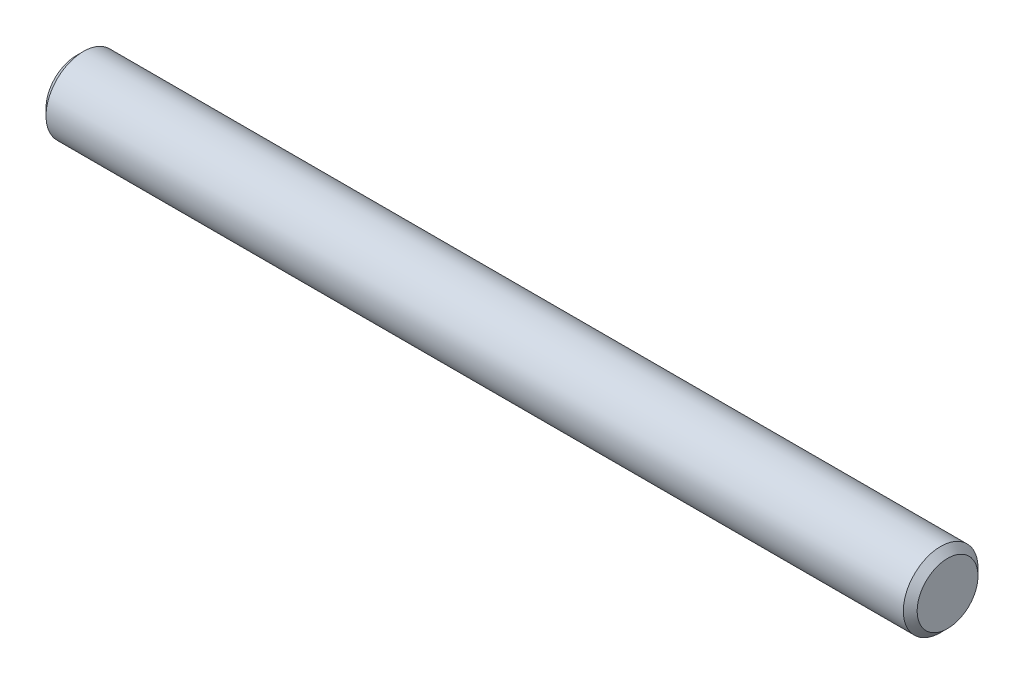
ISO-10303-21;
HEADER;
FILE_DESCRIPTION(('STEP AP214'),'2;1');
FILE_NAME('part.step','',(''),(''),'','','');
FILE_SCHEMA(('AUTOMOTIVE_DESIGN { 1 0 10303 214 1 1 1 1 }'));
ENDSEC;
DATA;
#1=APPLICATION_CONTEXT('core data for automotive mechanical design processes');
#2=APPLICATION_PROTOCOL_DEFINITION('international standard','automotive_design',2000,#1);
#3=PRODUCT_CONTEXT('',#1,'mechanical');
#4=PRODUCT('Part','Part','',(#3));
#5=PRODUCT_RELATED_PRODUCT_CATEGORY('part','',(#4));
#6=PRODUCT_DEFINITION_FORMATION('','',#4);
#7=PRODUCT_DEFINITION_CONTEXT('part definition',#1,'design');
#8=PRODUCT_DEFINITION('design','',#6,#7);
#9=PRODUCT_DEFINITION_SHAPE('','',#8);
#10=(LENGTH_UNIT() NAMED_UNIT(*) SI_UNIT(.MILLI.,.METRE.));
#11=(NAMED_UNIT(*) PLANE_ANGLE_UNIT() SI_UNIT($,.RADIAN.));
#12=(NAMED_UNIT(*) SI_UNIT($,.STERADIAN.) SOLID_ANGLE_UNIT());
#13=UNCERTAINTY_MEASURE_WITH_UNIT(LENGTH_MEASURE(1.E-05),#10,'distance_accuracy_value','');
#14=(GEOMETRIC_REPRESENTATION_CONTEXT(3) GLOBAL_UNCERTAINTY_ASSIGNED_CONTEXT((#13)) GLOBAL_UNIT_ASSIGNED_CONTEXT((#10,
#11,#12)) REPRESENTATION_CONTEXT('',''));
#15=CARTESIAN_POINT('',(0.,0.,0.));
#16=DIRECTION('',(0.,0.,1.));
#17=DIRECTION('',(1.,0.,0.));
#18=AXIS2_PLACEMENT_3D('',#15,#16,#17);
#19=CARTESIAN_POINT('',(35.,0.,0.));
#20=DIRECTION('',(1.,0.,0.));
#21=DIRECTION('',(0.,0.,-1.));
#22=AXIS2_PLACEMENT_3D('',#19,#20,#21);
#23=CYLINDRICAL_SURFACE('',#22,3.);
#24=CARTESIAN_POINT('',(-34.4455,0.,0.));
#25=DIRECTION('',(1.,0.,0.));
#26=DIRECTION('',(0.,0.,-1.));
#27=AXIS2_PLACEMENT_3D('',#24,#25,#26);
#28=CIRCLE('',#27,3.);
#29=CARTESIAN_POINT('',(-34.4455,0.,-3.));
#30=VERTEX_POINT('',#29);
#31=EDGE_CURVE('E54',#30,#30,#28,.T.);
#32=ORIENTED_EDGE('',*,*,#31,.T.);
#33=EDGE_LOOP('',(#32));
#34=FACE_BOUND('',#33,.T.);
#35=CARTESIAN_POINT('',(34.4455,0.,0.));
#36=DIRECTION('',(-1.,0.,0.));
#37=DIRECTION('',(0.,0.,1.));
#38=AXIS2_PLACEMENT_3D('',#35,#36,#37);
#39=CIRCLE('',#38,3.);
#40=CARTESIAN_POINT('',(34.4455,0.,3.));
#41=VERTEX_POINT('',#40);
#42=EDGE_CURVE('E10',#41,#41,#39,.T.);
#43=ORIENTED_EDGE('',*,*,#42,.T.);
#44=EDGE_LOOP('',(#43));
#45=FACE_BOUND('',#44,.T.);
#46=ADVANCED_FACE('F43',(#34,#45),#23,.T.);
#47=CARTESIAN_POINT('',(35.,0.,0.));
#48=DIRECTION('',(-1.,0.,0.));
#49=DIRECTION('',(0.,0.,1.));
#50=AXIS2_PLACEMENT_3D('',#47,#48,#49);
#51=CONICAL_SURFACE('',#50,2.4455,0.785398163397464);
#52=ORIENTED_EDGE('',*,*,#42,.F.);
#53=EDGE_LOOP('',(#52));
#54=FACE_BOUND('',#53,.T.);
#55=CARTESIAN_POINT('',(35.,0.,0.));
#56=DIRECTION('',(-1.,0.,0.));
#57=DIRECTION('',(0.,0.,1.));
#58=AXIS2_PLACEMENT_3D('',#55,#56,#57);
#59=CIRCLE('',#58,2.4455);
#60=CARTESIAN_POINT('',(35.,0.,2.4455));
#61=VERTEX_POINT('',#60);
#62=EDGE_CURVE('E50',#61,#61,#59,.T.);
#63=ORIENTED_EDGE('',*,*,#62,.T.);
#64=EDGE_LOOP('',(#63));
#65=FACE_BOUND('',#64,.T.);
#66=ADVANCED_FACE('F77',(#54,#65),#51,.T.);
#67=CARTESIAN_POINT('',(35.,0.,0.));
#68=DIRECTION('',(-1.,0.,0.));
#69=DIRECTION('',(0.,0.,1.));
#70=AXIS2_PLACEMENT_3D('',#67,#68,#69);
#71=PLANE('',#70);
#72=ORIENTED_EDGE('',*,*,#62,.F.);
#73=EDGE_LOOP('',(#72));
#74=FACE_BOUND('',#73,.T.);
#75=ADVANCED_FACE('F45',(#74),#71,.F.);
#76=CARTESIAN_POINT('',(-35.,0.,0.));
#77=DIRECTION('',(1.,0.,0.));
#78=DIRECTION('',(0.,0.,-1.));
#79=AXIS2_PLACEMENT_3D('',#76,#77,#78);
#80=CONICAL_SURFACE('',#79,2.4455,0.785398163397464);
#81=ORIENTED_EDGE('',*,*,#31,.F.);
#82=EDGE_LOOP('',(#81));
#83=FACE_BOUND('',#82,.T.);
#84=CARTESIAN_POINT('',(-35.,0.,0.));
#85=DIRECTION('',(1.,0.,0.));
#86=DIRECTION('',(0.,0.,-1.));
#87=AXIS2_PLACEMENT_3D('',#84,#85,#86);
#88=CIRCLE('',#87,2.4455);
#89=CARTESIAN_POINT('',(-35.,0.,-2.4455));
#90=VERTEX_POINT('',#89);
#91=EDGE_CURVE('E58',#90,#90,#88,.T.);
#92=ORIENTED_EDGE('',*,*,#91,.T.);
#93=EDGE_LOOP('',(#92));
#94=FACE_BOUND('',#93,.T.);
#95=ADVANCED_FACE('F64',(#83,#94),#80,.T.);
#96=CARTESIAN_POINT('',(-35.,0.,3.));
#97=DIRECTION('',(1.,0.,0.));
#98=DIRECTION('',(0.,0.,-1.));
#99=AXIS2_PLACEMENT_3D('',#96,#97,#98);
#100=PLANE('',#99);
#101=ORIENTED_EDGE('',*,*,#91,.F.);
#102=EDGE_LOOP('',(#101));
#103=FACE_BOUND('',#102,.T.);
#104=ADVANCED_FACE('F66',(#103),#100,.F.);
#105=CLOSED_SHELL('',(#46,#66,#75,#95,#104));
#106=MANIFOLD_SOLID_BREP('B2',#105);
#107=ADVANCED_BREP_SHAPE_REPRESENTATION('',(#18,#106),#14);
#108=SHAPE_DEFINITION_REPRESENTATION(#9,#107);
ENDSEC;
END-ISO-10303-21;
